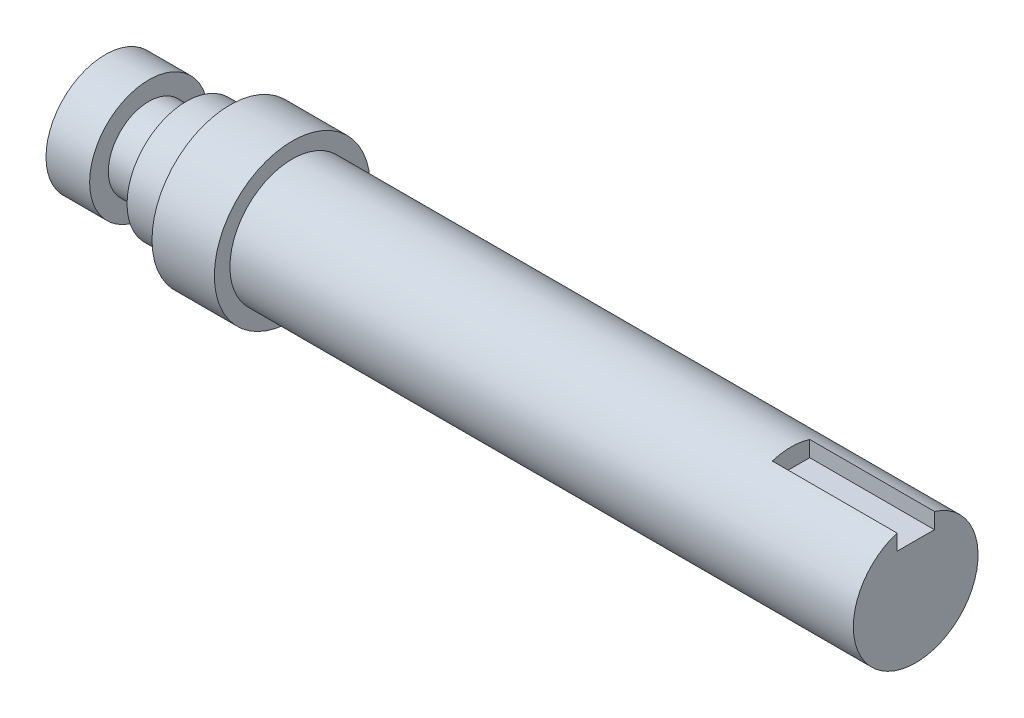
ISO-10303-21;
HEADER;
FILE_DESCRIPTION(('STEP AP214'),'2;1');
FILE_NAME('part.step','',(''),(''),'','','');
FILE_SCHEMA(('AUTOMOTIVE_DESIGN { 1 0 10303 214 1 1 1 1 }'));
ENDSEC;
DATA;
#1=APPLICATION_CONTEXT('core data for automotive mechanical design processes');
#2=APPLICATION_PROTOCOL_DEFINITION('international standard','automotive_design',2000,#1);
#3=PRODUCT_CONTEXT('',#1,'mechanical');
#4=PRODUCT('Part','Part','',(#3));
#5=PRODUCT_RELATED_PRODUCT_CATEGORY('part','',(#4));
#6=PRODUCT_DEFINITION_FORMATION('','',#4);
#7=PRODUCT_DEFINITION_CONTEXT('part definition',#1,'design');
#8=PRODUCT_DEFINITION('design','',#6,#7);
#9=PRODUCT_DEFINITION_SHAPE('','',#8);
#10=(LENGTH_UNIT() NAMED_UNIT(*) SI_UNIT(.MILLI.,.METRE.));
#11=(NAMED_UNIT(*) PLANE_ANGLE_UNIT() SI_UNIT($,.RADIAN.));
#12=(NAMED_UNIT(*) SI_UNIT($,.STERADIAN.) SOLID_ANGLE_UNIT());
#13=UNCERTAINTY_MEASURE_WITH_UNIT(LENGTH_MEASURE(1.E-05),#10,'distance_accuracy_value','');
#14=(GEOMETRIC_REPRESENTATION_CONTEXT(3) GLOBAL_UNCERTAINTY_ASSIGNED_CONTEXT((#13)) GLOBAL_UNIT_ASSIGNED_CONTEXT((#10,
#11,#12)) REPRESENTATION_CONTEXT('',''));
#15=CARTESIAN_POINT('',(0.,0.,0.));
#16=DIRECTION('',(0.,0.,1.));
#17=DIRECTION('',(1.,0.,0.));
#18=AXIS2_PLACEMENT_3D('',#15,#16,#17);
#19=CARTESIAN_POINT('',(-130.,0.,0.));
#20=DIRECTION('',(-1.,0.,0.));
#21=DIRECTION('',(0.,0.,1.));
#22=AXIS2_PLACEMENT_3D('',#19,#20,#21);
#23=CYLINDRICAL_SURFACE('',#22,9.5);
#24=CARTESIAN_POINT('',(-110.,0.,0.));
#25=DIRECTION('',(-1.,0.,0.));
#26=DIRECTION('',(0.,0.,1.));
#27=AXIS2_PLACEMENT_3D('',#24,#25,#26);
#28=CIRCLE('',#27,9.5);
#29=CARTESIAN_POINT('',(-110.,0.,9.5));
#30=VERTEX_POINT('',#29);
#31=EDGE_CURVE('E118',#30,#30,#28,.T.);
#32=ORIENTED_EDGE('',*,*,#31,.T.);
#33=EDGE_LOOP('',(#32));
#34=FACE_BOUND('',#33,.T.);
#35=CARTESIAN_POINT('',(-117.,0.,0.));
#36=DIRECTION('',(-1.,0.,0.));
#37=DIRECTION('',(0.,0.,1.));
#38=AXIS2_PLACEMENT_3D('',#35,#36,#37);
#39=CIRCLE('',#38,9.5);
#40=CARTESIAN_POINT('',(-117.,0.,9.5));
#41=VERTEX_POINT('',#40);
#42=EDGE_CURVE('E107',#41,#41,#39,.T.);
#43=ORIENTED_EDGE('',*,*,#42,.F.);
#44=EDGE_LOOP('',(#43));
#45=FACE_BOUND('',#44,.T.);
#46=ADVANCED_FACE('F39',(#34,#45),#23,.T.);
#47=CARTESIAN_POINT('',(0.,0.,0.));
#48=DIRECTION('',(-1.,0.,0.));
#49=DIRECTION('',(0.,0.,1.));
#50=AXIS2_PLACEMENT_3D('',#47,#48,#49);
#51=PLANE('',#50);
#52=DIRECTION('',(0.,0.,1.));
#53=VECTOR('',#52,1.);
#54=CARTESIAN_POINT('',(0.,6.99999999999999,-3.));
#55=LINE('',#54,#53);
#56=CARTESIAN_POINT('',(0.,6.99999999999999,-3.));
#57=VERTEX_POINT('',#56);
#58=CARTESIAN_POINT('',(0.,6.99999999999999,3.));
#59=VERTEX_POINT('',#58);
#60=EDGE_CURVE('E93',#57,#59,#55,.T.);
#61=ORIENTED_EDGE('',*,*,#60,.T.);
#62=DIRECTION('',(0.,1.,0.));
#63=VECTOR('',#62,1.);
#64=CARTESIAN_POINT('',(0.,12.,3.));
#65=LINE('',#64,#63);
#66=CARTESIAN_POINT('',(0.,9.53939201416945,3.));
#67=VERTEX_POINT('',#66);
#68=EDGE_CURVE('E98',#59,#67,#65,.T.);
#69=ORIENTED_EDGE('',*,*,#68,.T.);
#70=CARTESIAN_POINT('',(0.,0.,0.));
#71=DIRECTION('',(-1.,0.,0.));
#72=DIRECTION('',(0.,0.,1.));
#73=AXIS2_PLACEMENT_3D('',#70,#71,#72);
#74=CIRCLE('',#73,10.);
#75=CARTESIAN_POINT('',(0.,9.53939201416945,-3.));
#76=VERTEX_POINT('',#75);
#77=EDGE_CURVE('E135',#76,#67,#74,.T.);
#78=ORIENTED_EDGE('',*,*,#77,.F.);
#79=DIRECTION('',(0.,1.,0.));
#80=VECTOR('',#79,1.);
#81=CARTESIAN_POINT('',(0.,12.,-3.));
#82=LINE('',#81,#80);
#83=EDGE_CURVE('E81',#57,#76,#82,.T.);
#84=ORIENTED_EDGE('',*,*,#83,.F.);
#85=EDGE_LOOP('',(#61,#69,#78,#84));
#86=FACE_BOUND('',#85,.T.);
#87=ADVANCED_FACE('F41',(#86),#51,.F.);
#88=CARTESIAN_POINT('',(-130.,0.,0.));
#89=DIRECTION('',(-1.,0.,0.));
#90=DIRECTION('',(0.,0.,1.));
#91=AXIS2_PLACEMENT_3D('',#88,#89,#90);
#92=CYLINDRICAL_SURFACE('',#91,9.99999999999999);
#93=CARTESIAN_POINT('',(-100.,0.,0.));
#94=DIRECTION('',(-1.,0.,0.));
#95=DIRECTION('',(0.,0.,1.));
#96=AXIS2_PLACEMENT_3D('',#93,#94,#95);
#97=CIRCLE('',#96,9.99999999999999);
#98=CARTESIAN_POINT('',(-100.,0.,9.99999999999999));
#99=VERTEX_POINT('',#98);
#100=EDGE_CURVE('E129',#99,#99,#97,.T.);
#101=ORIENTED_EDGE('',*,*,#100,.F.);
#102=EDGE_LOOP('',(#101));
#103=FACE_BOUND('',#102,.T.);
#104=CARTESIAN_POINT('',(-20.,0.,0.));
#105=DIRECTION('',(-1.,0.,0.));
#106=DIRECTION('',(0.,-1.,0.));
#107=AXIS2_PLACEMENT_3D('',#104,#105,#106);
#108=CIRCLE('',#107,9.99999999999999);
#109=CARTESIAN_POINT('',(-20.,9.53939201416945,3.));
#110=VERTEX_POINT('',#109);
#111=CARTESIAN_POINT('',(-20.,9.53939201416945,-3.));
#112=VERTEX_POINT('',#111);
#113=EDGE_CURVE('E50',#110,#112,#108,.T.);
#114=ORIENTED_EDGE('',*,*,#113,.T.);
#115=DIRECTION('',(-1.,0.,0.));
#116=VECTOR('',#115,1.);
#117=CARTESIAN_POINT('',(-130.,9.53939201416945,-3.));
#118=LINE('',#117,#116);
#119=EDGE_CURVE('E11',#112,#76,#118,.F.);
#120=ORIENTED_EDGE('',*,*,#119,.T.);
#121=ORIENTED_EDGE('',*,*,#77,.T.);
#122=DIRECTION('',(-1.,0.,0.));
#123=VECTOR('',#122,1.);
#124=CARTESIAN_POINT('',(-130.,9.53939201416945,3.));
#125=LINE('',#124,#123);
#126=EDGE_CURVE('E133',#110,#67,#125,.F.);
#127=ORIENTED_EDGE('',*,*,#126,.F.);
#128=EDGE_LOOP('',(#114,#120,#121,#127));
#129=FACE_BOUND('',#128,.T.);
#130=ADVANCED_FACE('F139',(#103,#129),#92,.T.);
#131=CARTESIAN_POINT('',(-100.,9.99999999999999,0.));
#132=DIRECTION('',(-1.,0.,0.));
#133=DIRECTION('',(0.,0.,1.));
#134=AXIS2_PLACEMENT_3D('',#131,#132,#133);
#135=PLANE('',#134);
#136=CARTESIAN_POINT('',(-100.,0.,0.));
#137=DIRECTION('',(-1.,0.,0.));
#138=DIRECTION('',(0.,0.,1.));
#139=AXIS2_PLACEMENT_3D('',#136,#137,#138);
#140=CIRCLE('',#139,12.5);
#141=CARTESIAN_POINT('',(-100.,0.,12.5));
#142=VERTEX_POINT('',#141);
#143=EDGE_CURVE('E127',#142,#142,#140,.T.);
#144=ORIENTED_EDGE('',*,*,#143,.F.);
#145=EDGE_LOOP('',(#144));
#146=FACE_BOUND('',#145,.T.);
#147=ORIENTED_EDGE('',*,*,#100,.T.);
#148=EDGE_LOOP('',(#147));
#149=FACE_BOUND('',#148,.T.);
#150=ADVANCED_FACE('F150',(#146,#149),#135,.F.);
#151=CARTESIAN_POINT('',(-130.,0.,0.));
#152=DIRECTION('',(-1.,0.,0.));
#153=DIRECTION('',(0.,0.,1.));
#154=AXIS2_PLACEMENT_3D('',#151,#152,#153);
#155=CYLINDRICAL_SURFACE('',#154,12.5);
#156=CARTESIAN_POINT('',(-110.,0.,0.));
#157=DIRECTION('',(-1.,0.,0.));
#158=DIRECTION('',(0.,0.,1.));
#159=AXIS2_PLACEMENT_3D('',#156,#157,#158);
#160=CIRCLE('',#159,12.5);
#161=CARTESIAN_POINT('',(-110.,0.,12.5));
#162=VERTEX_POINT('',#161);
#163=EDGE_CURVE('E124',#162,#162,#160,.T.);
#164=ORIENTED_EDGE('',*,*,#163,.F.);
#165=EDGE_LOOP('',(#164));
#166=FACE_BOUND('',#165,.T.);
#167=ORIENTED_EDGE('',*,*,#143,.T.);
#168=EDGE_LOOP('',(#167));
#169=FACE_BOUND('',#168,.T.);
#170=ADVANCED_FACE('F184',(#166,#169),#155,.T.);
#171=CARTESIAN_POINT('',(-110.,12.5,0.));
#172=DIRECTION('',(1.,0.,0.));
#173=DIRECTION('',(0.,0.,-1.));
#174=AXIS2_PLACEMENT_3D('',#171,#172,#173);
#175=PLANE('',#174);
#176=ORIENTED_EDGE('',*,*,#31,.F.);
#177=EDGE_LOOP('',(#176));
#178=FACE_BOUND('',#177,.T.);
#179=ORIENTED_EDGE('',*,*,#163,.T.);
#180=EDGE_LOOP('',(#179));
#181=FACE_BOUND('',#180,.T.);
#182=ADVANCED_FACE('F173',(#178,#181),#175,.F.);
#183=CARTESIAN_POINT('',(-123.,9.5,0.));
#184=DIRECTION('',(1.,0.,0.));
#185=DIRECTION('',(0.,0.,-1.));
#186=AXIS2_PLACEMENT_3D('',#183,#184,#185);
#187=PLANE('',#186);
#188=CARTESIAN_POINT('',(-123.,0.,0.));
#189=DIRECTION('',(-1.,0.,0.));
#190=DIRECTION('',(0.,0.,1.));
#191=AXIS2_PLACEMENT_3D('',#188,#189,#190);
#192=CIRCLE('',#191,6.5);
#193=CARTESIAN_POINT('',(-123.,0.,6.5));
#194=VERTEX_POINT('',#193);
#195=EDGE_CURVE('E111',#194,#194,#192,.T.);
#196=ORIENTED_EDGE('',*,*,#195,.T.);
#197=EDGE_LOOP('',(#196));
#198=FACE_BOUND('',#197,.T.);
#199=CARTESIAN_POINT('',(-123.,0.,0.));
#200=DIRECTION('',(-1.,0.,0.));
#201=DIRECTION('',(0.,0.,1.));
#202=AXIS2_PLACEMENT_3D('',#199,#200,#201);
#203=CIRCLE('',#202,9.5);
#204=CARTESIAN_POINT('',(-123.,0.,9.5));
#205=VERTEX_POINT('',#204);
#206=EDGE_CURVE('E102',#205,#205,#203,.T.);
#207=ORIENTED_EDGE('',*,*,#206,.F.);
#208=EDGE_LOOP('',(#207));
#209=FACE_BOUND('',#208,.T.);
#210=ADVANCED_FACE('F174',(#198,#209),#187,.T.);
#211=CARTESIAN_POINT('',(-130.,0.,0.));
#212=DIRECTION('',(-1.,0.,0.));
#213=DIRECTION('',(0.,0.,1.));
#214=AXIS2_PLACEMENT_3D('',#211,#212,#213);
#215=CYLINDRICAL_SURFACE('',#214,6.5);
#216=CARTESIAN_POINT('',(-117.,0.,0.));
#217=DIRECTION('',(-1.,0.,0.));
#218=DIRECTION('',(0.,0.,1.));
#219=AXIS2_PLACEMENT_3D('',#216,#217,#218);
#220=CIRCLE('',#219,6.5);
#221=CARTESIAN_POINT('',(-117.,0.,6.5));
#222=VERTEX_POINT('',#221);
#223=EDGE_CURVE('E112',#222,#222,#220,.T.);
#224=ORIENTED_EDGE('',*,*,#223,.T.);
#225=EDGE_LOOP('',(#224));
#226=FACE_BOUND('',#225,.T.);
#227=ORIENTED_EDGE('',*,*,#195,.F.);
#228=EDGE_LOOP('',(#227));
#229=FACE_BOUND('',#228,.T.);
#230=ADVANCED_FACE('F171',(#226,#229),#215,.T.);
#231=CARTESIAN_POINT('',(-117.,9.5,0.));
#232=DIRECTION('',(-1.,0.,0.));
#233=DIRECTION('',(0.,0.,1.));
#234=AXIS2_PLACEMENT_3D('',#231,#232,#233);
#235=PLANE('',#234);
#236=ORIENTED_EDGE('',*,*,#42,.T.);
#237=EDGE_LOOP('',(#236));
#238=FACE_BOUND('',#237,.T.);
#239=ORIENTED_EDGE('',*,*,#223,.F.);
#240=EDGE_LOOP('',(#239));
#241=FACE_BOUND('',#240,.T.);
#242=ADVANCED_FACE('F170',(#238,#241),#235,.T.);
#243=CARTESIAN_POINT('',(-130.,9.5,0.));
#244=DIRECTION('',(1.,0.,0.));
#245=DIRECTION('',(0.,0.,-1.));
#246=AXIS2_PLACEMENT_3D('',#243,#244,#245);
#247=PLANE('',#246);
#248=CARTESIAN_POINT('',(-130.,0.,0.));
#249=DIRECTION('',(-1.,0.,0.));
#250=DIRECTION('',(0.,0.,1.));
#251=AXIS2_PLACEMENT_3D('',#248,#249,#250);
#252=CIRCLE('',#251,9.5);
#253=CARTESIAN_POINT('',(-130.,0.,9.5));
#254=VERTEX_POINT('',#253);
#255=EDGE_CURVE('E120',#254,#254,#252,.T.);
#256=ORIENTED_EDGE('',*,*,#255,.T.);
#257=EDGE_LOOP('',(#256));
#258=FACE_BOUND('',#257,.T.);
#259=ADVANCED_FACE('F159',(#258),#247,.F.);
#260=ORIENTED_EDGE('',*,*,#255,.F.);
#261=EDGE_LOOP('',(#260));
#262=FACE_BOUND('',#261,.T.);
#263=ORIENTED_EDGE('',*,*,#206,.T.);
#264=EDGE_LOOP('',(#263));
#265=FACE_BOUND('',#264,.T.);
#266=ADVANCED_FACE('F155',(#262,#265),#23,.T.);
#267=CARTESIAN_POINT('',(-20.,12.,-3.));
#268=DIRECTION('',(-1.,0.,0.));
#269=DIRECTION('',(0.,-1.,0.));
#270=AXIS2_PLACEMENT_3D('',#267,#268,#269);
#271=PLANE('',#270);
#272=DIRECTION('',(0.,-1.,0.));
#273=VECTOR('',#272,1.);
#274=CARTESIAN_POINT('',(-20.,12.,3.));
#275=LINE('',#274,#273);
#276=CARTESIAN_POINT('',(-20.,6.99999999999999,3.));
#277=VERTEX_POINT('',#276);
#278=EDGE_CURVE('E53',#110,#277,#275,.T.);
#279=ORIENTED_EDGE('',*,*,#278,.T.);
#280=DIRECTION('',(0.,0.,1.));
#281=VECTOR('',#280,1.);
#282=CARTESIAN_POINT('',(-20.,6.99999999999999,-3.));
#283=LINE('',#282,#281);
#284=CARTESIAN_POINT('',(-20.,6.99999999999999,-3.));
#285=VERTEX_POINT('',#284);
#286=EDGE_CURVE('E87',#285,#277,#283,.T.);
#287=ORIENTED_EDGE('',*,*,#286,.F.);
#288=DIRECTION('',(0.,-1.,0.));
#289=VECTOR('',#288,1.);
#290=CARTESIAN_POINT('',(-20.,12.,-3.));
#291=LINE('',#290,#289);
#292=EDGE_CURVE('E77',#112,#285,#291,.T.);
#293=ORIENTED_EDGE('',*,*,#292,.F.);
#294=ORIENTED_EDGE('',*,*,#113,.F.);
#295=EDGE_LOOP('',(#279,#287,#293,#294));
#296=FACE_BOUND('',#295,.T.);
#297=ADVANCED_FACE('F86',(#296),#271,.F.);
#298=CARTESIAN_POINT('',(0.,0.,-3.));
#299=DIRECTION('',(0.,0.,-1.));
#300=DIRECTION('',(-1.,0.,0.));
#301=AXIS2_PLACEMENT_3D('',#298,#299,#300);
#302=PLANE('',#301);
#303=ORIENTED_EDGE('',*,*,#292,.T.);
#304=DIRECTION('',(1.,0.,0.));
#305=VECTOR('',#304,1.);
#306=CARTESIAN_POINT('',(0.,6.99999999999999,-3.));
#307=LINE('',#306,#305);
#308=EDGE_CURVE('E78',#285,#57,#307,.T.);
#309=ORIENTED_EDGE('',*,*,#308,.T.);
#310=ORIENTED_EDGE('',*,*,#83,.T.);
#311=ORIENTED_EDGE('',*,*,#119,.F.);
#312=EDGE_LOOP('',(#303,#309,#310,#311));
#313=FACE_BOUND('',#312,.T.);
#314=ADVANCED_FACE('F79',(#313),#302,.F.);
#315=CARTESIAN_POINT('',(0.,0.,3.));
#316=DIRECTION('',(0.,0.,-1.));
#317=DIRECTION('',(-1.,0.,0.));
#318=AXIS2_PLACEMENT_3D('',#315,#316,#317);
#319=PLANE('',#318);
#320=ORIENTED_EDGE('',*,*,#126,.T.);
#321=ORIENTED_EDGE('',*,*,#68,.F.);
#322=DIRECTION('',(1.,0.,0.));
#323=VECTOR('',#322,1.);
#324=CARTESIAN_POINT('',(0.,6.99999999999999,3.));
#325=LINE('',#324,#323);
#326=EDGE_CURVE('E105',#277,#59,#325,.T.);
#327=ORIENTED_EDGE('',*,*,#326,.F.);
#328=ORIENTED_EDGE('',*,*,#278,.F.);
#329=EDGE_LOOP('',(#320,#321,#327,#328));
#330=FACE_BOUND('',#329,.T.);
#331=ADVANCED_FACE('F138',(#330),#319,.T.);
#332=CARTESIAN_POINT('',(0.,6.99999999999999,-3.));
#333=DIRECTION('',(0.,-1.,0.));
#334=DIRECTION('',(1.,0.,0.));
#335=AXIS2_PLACEMENT_3D('',#332,#333,#334);
#336=PLANE('',#335);
#337=ORIENTED_EDGE('',*,*,#326,.T.);
#338=ORIENTED_EDGE('',*,*,#60,.F.);
#339=ORIENTED_EDGE('',*,*,#308,.F.);
#340=ORIENTED_EDGE('',*,*,#286,.T.);
#341=EDGE_LOOP('',(#337,#338,#339,#340));
#342=FACE_BOUND('',#341,.T.);
#343=ADVANCED_FACE('F91',(#342),#336,.F.);
#344=CLOSED_SHELL('',(#46,#87,#130,#150,#170,#182,#210,#230,#242,#259,#266,#297,#314,#331,#343));
#345=MANIFOLD_SOLID_BREP('B2',#344);
#346=ADVANCED_BREP_SHAPE_REPRESENTATION('',(#18,#345),#14);
#347=SHAPE_DEFINITION_REPRESENTATION(#9,#346);
ENDSEC;
END-ISO-10303-21;
